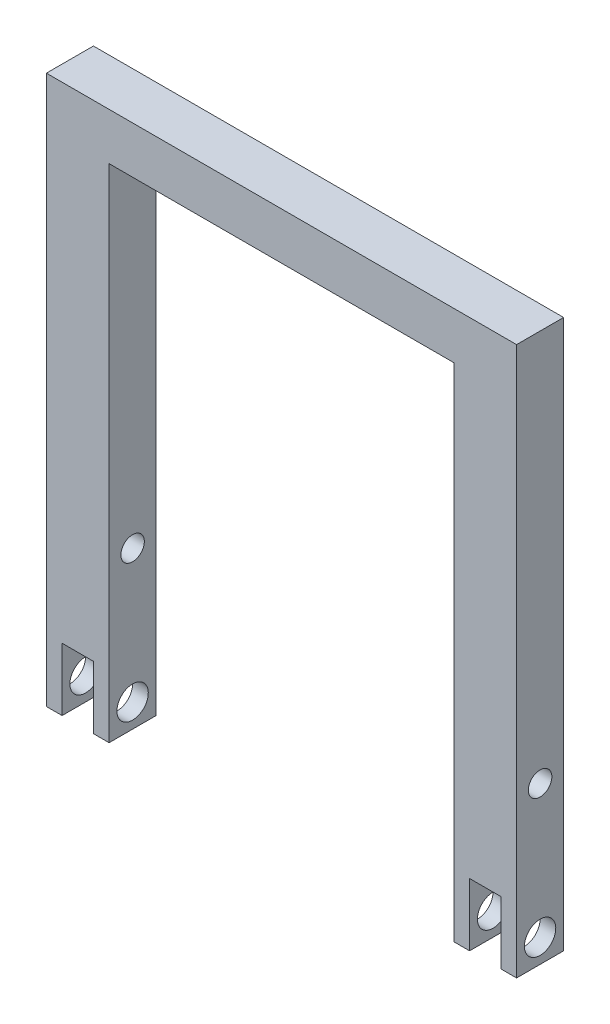
ISO-10303-21;
HEADER;
FILE_DESCRIPTION(('STEP AP214'),'2;1');
FILE_NAME('part.step','',(''),(''),'','','');
FILE_SCHEMA(('AUTOMOTIVE_DESIGN { 1 0 10303 214 1 1 1 1 }'));
ENDSEC;
DATA;
#1=APPLICATION_CONTEXT('core data for automotive mechanical design processes');
#2=APPLICATION_PROTOCOL_DEFINITION('international standard','automotive_design',2000,#1);
#3=PRODUCT_CONTEXT('',#1,'mechanical');
#4=PRODUCT('Part','Part','',(#3));
#5=PRODUCT_RELATED_PRODUCT_CATEGORY('part','',(#4));
#6=PRODUCT_DEFINITION_FORMATION('','',#4);
#7=PRODUCT_DEFINITION_CONTEXT('part definition',#1,'design');
#8=PRODUCT_DEFINITION('design','',#6,#7);
#9=PRODUCT_DEFINITION_SHAPE('','',#8);
#10=(LENGTH_UNIT() NAMED_UNIT(*) SI_UNIT(.MILLI.,.METRE.));
#11=(NAMED_UNIT(*) PLANE_ANGLE_UNIT() SI_UNIT($,.RADIAN.));
#12=(NAMED_UNIT(*) SI_UNIT($,.STERADIAN.) SOLID_ANGLE_UNIT());
#13=UNCERTAINTY_MEASURE_WITH_UNIT(LENGTH_MEASURE(1.E-05),#10,'distance_accuracy_value','');
#14=(GEOMETRIC_REPRESENTATION_CONTEXT(3) GLOBAL_UNCERTAINTY_ASSIGNED_CONTEXT((#13)) GLOBAL_UNIT_ASSIGNED_CONTEXT((#10,
#11,#12)) REPRESENTATION_CONTEXT('',''));
#15=CARTESIAN_POINT('',(0.,0.,0.));
#16=DIRECTION('',(0.,0.,1.));
#17=DIRECTION('',(1.,0.,0.));
#18=AXIS2_PLACEMENT_3D('',#15,#16,#17);
#19=CARTESIAN_POINT('',(-150.,-170.717131474104,30.));
#20=DIRECTION('',(0.,1.,0.));
#21=DIRECTION('',(0.,0.,1.));
#22=AXIS2_PLACEMENT_3D('',#19,#20,#21);
#23=PLANE('',#22);
#24=DIRECTION('',(1.,0.,0.));
#25=VECTOR('',#24,1.);
#26=CARTESIAN_POINT('',(-150.,-170.717131474104,0.));
#27=LINE('',#26,#25);
#28=CARTESIAN_POINT('',(110.,-170.717131474104,0.));
#29=VERTEX_POINT('',#28);
#30=CARTESIAN_POINT('',(120.,-170.717131474104,0.));
#31=VERTEX_POINT('',#30);
#32=EDGE_CURVE('E271',#29,#31,#27,.T.);
#33=ORIENTED_EDGE('',*,*,#32,.T.);
#34=DIRECTION('',(0.,0.,-1.));
#35=VECTOR('',#34,1.);
#36=CARTESIAN_POINT('',(120.,-170.717131474104,30.));
#37=LINE('',#36,#35);
#38=CARTESIAN_POINT('',(120.,-170.717131474104,30.));
#39=VERTEX_POINT('',#38);
#40=EDGE_CURVE('E299',#39,#31,#37,.T.);
#41=ORIENTED_EDGE('',*,*,#40,.F.);
#42=DIRECTION('',(1.,0.,0.));
#43=VECTOR('',#42,1.);
#44=CARTESIAN_POINT('',(-150.,-170.717131474104,30.));
#45=LINE('',#44,#43);
#46=CARTESIAN_POINT('',(110.,-170.717131474104,30.));
#47=VERTEX_POINT('',#46);
#48=EDGE_CURVE('E259',#47,#39,#45,.T.);
#49=ORIENTED_EDGE('',*,*,#48,.F.);
#50=DIRECTION('',(0.,0.,1.));
#51=VECTOR('',#50,1.);
#52=CARTESIAN_POINT('',(110.,-170.717131474104,0.));
#53=LINE('',#52,#51);
#54=EDGE_CURVE('E245',#29,#47,#53,.T.);
#55=ORIENTED_EDGE('',*,*,#54,.F.);
#56=EDGE_LOOP('',(#33,#41,#49,#55));
#57=FACE_BOUND('',#56,.T.);
#58=ADVANCED_FACE('F33',(#57),#23,.F.);
#59=CARTESIAN_POINT('',(150.,-155.717131474104,15.));
#60=DIRECTION('',(-1.,0.,0.));
#61=DIRECTION('',(0.,-1.,0.));
#62=AXIS2_PLACEMENT_3D('',#59,#60,#61);
#63=CYLINDRICAL_SURFACE('',#62,10.);
#64=CARTESIAN_POINT('',(120.,-155.717131474104,15.));
#65=DIRECTION('',(-1.,0.,0.));
#66=DIRECTION('',(0.,0.,1.));
#67=AXIS2_PLACEMENT_3D('',#64,#65,#66);
#68=CIRCLE('',#67,10.);
#69=CARTESIAN_POINT('',(120.,-155.717131474104,25.0000000000001));
#70=VERTEX_POINT('',#69);
#71=EDGE_CURVE('E37',#70,#70,#68,.F.);
#72=ORIENTED_EDGE('',*,*,#71,.T.);
#73=EDGE_LOOP('',(#72));
#74=FACE_BOUND('',#73,.T.);
#75=CARTESIAN_POINT('',(110.,-155.717131474104,15.));
#76=DIRECTION('',(1.,0.,0.));
#77=DIRECTION('',(0.,1.,0.));
#78=AXIS2_PLACEMENT_3D('',#75,#76,#77);
#79=CIRCLE('',#78,10.);
#80=CARTESIAN_POINT('',(110.,-145.717131474104,15.));
#81=VERTEX_POINT('',#80);
#82=EDGE_CURVE('E203',#81,#81,#79,.T.);
#83=ORIENTED_EDGE('',*,*,#82,.F.);
#84=EDGE_LOOP('',(#83));
#85=FACE_BOUND('',#84,.T.);
#86=ADVANCED_FACE('F362',(#74,#85),#63,.F.);
#87=CARTESIAN_POINT('',(-150.,-170.717131474104,0.));
#88=VERTEX_POINT('',#87);
#89=CARTESIAN_POINT('',(-140.,-170.717131474104,0.));
#90=VERTEX_POINT('',#89);
#91=EDGE_CURVE('E266',#88,#90,#27,.T.);
#92=ORIENTED_EDGE('',*,*,#91,.T.);
#93=DIRECTION('',(0.,0.,-1.));
#94=VECTOR('',#93,1.);
#95=CARTESIAN_POINT('',(-140.,-170.717131474104,30.));
#96=LINE('',#95,#94);
#97=CARTESIAN_POINT('',(-140.,-170.717131474104,30.));
#98=VERTEX_POINT('',#97);
#99=EDGE_CURVE('E187',#98,#90,#96,.T.);
#100=ORIENTED_EDGE('',*,*,#99,.F.);
#101=CARTESIAN_POINT('',(-150.,-170.717131474104,30.));
#102=VERTEX_POINT('',#101);
#103=EDGE_CURVE('E254',#102,#98,#45,.T.);
#104=ORIENTED_EDGE('',*,*,#103,.F.);
#105=DIRECTION('',(0.,0.,-1.));
#106=VECTOR('',#105,1.);
#107=CARTESIAN_POINT('',(-150.,-170.717131474104,30.));
#108=LINE('',#107,#106);
#109=EDGE_CURVE('E11',#102,#88,#108,.T.);
#110=ORIENTED_EDGE('',*,*,#109,.T.);
#111=EDGE_LOOP('',(#92,#100,#104,#110));
#112=FACE_BOUND('',#111,.T.);
#113=ADVANCED_FACE('F329',(#112),#23,.F.);
#114=CARTESIAN_POINT('',(-140.,-155.717131474104,15.));
#115=DIRECTION('',(-1.,0.,0.));
#116=DIRECTION('',(0.,0.,1.));
#117=AXIS2_PLACEMENT_3D('',#114,#115,#116);
#118=CIRCLE('',#117,10.);
#119=CARTESIAN_POINT('',(-140.,-155.717131474104,25.0000000000001));
#120=VERTEX_POINT('',#119);
#121=EDGE_CURVE('E207',#120,#120,#118,.F.);
#122=ORIENTED_EDGE('',*,*,#121,.T.);
#123=EDGE_LOOP('',(#122));
#124=FACE_BOUND('',#123,.T.);
#125=CARTESIAN_POINT('',(-150.,-155.717131474104,15.));
#126=DIRECTION('',(-1.,0.,0.));
#127=DIRECTION('',(0.,-1.,0.));
#128=AXIS2_PLACEMENT_3D('',#125,#126,#127);
#129=CIRCLE('',#128,10.);
#130=CARTESIAN_POINT('',(-150.,-165.717131474104,15.));
#131=VERTEX_POINT('',#130);
#132=EDGE_CURVE('E204',#131,#131,#129,.T.);
#133=ORIENTED_EDGE('',*,*,#132,.T.);
#134=EDGE_LOOP('',(#133));
#135=FACE_BOUND('',#134,.T.);
#136=ADVANCED_FACE('F366',(#124,#135),#63,.F.);
#137=CARTESIAN_POINT('',(-120.,-170.717131474104,30.));
#138=VERTEX_POINT('',#137);
#139=CARTESIAN_POINT('',(-110.,-170.717131474104,30.));
#140=VERTEX_POINT('',#139);
#141=EDGE_CURVE('E258',#138,#140,#45,.T.);
#142=ORIENTED_EDGE('',*,*,#141,.F.);
#143=DIRECTION('',(0.,0.,1.));
#144=VECTOR('',#143,1.);
#145=CARTESIAN_POINT('',(-120.,-170.717131474104,30.));
#146=LINE('',#145,#144);
#147=CARTESIAN_POINT('',(-120.,-170.717131474104,0.));
#148=VERTEX_POINT('',#147);
#149=EDGE_CURVE('E179',#148,#138,#146,.T.);
#150=ORIENTED_EDGE('',*,*,#149,.F.);
#151=CARTESIAN_POINT('',(-110.,-170.717131474104,0.));
#152=VERTEX_POINT('',#151);
#153=EDGE_CURVE('E270',#148,#152,#27,.T.);
#154=ORIENTED_EDGE('',*,*,#153,.T.);
#155=DIRECTION('',(0.,0.,1.));
#156=VECTOR('',#155,1.);
#157=CARTESIAN_POINT('',(-110.,-170.717131474104,0.));
#158=LINE('',#157,#156);
#159=EDGE_CURVE('E232',#152,#140,#158,.T.);
#160=ORIENTED_EDGE('',*,*,#159,.T.);
#161=EDGE_LOOP('',(#142,#150,#154,#160));
#162=FACE_BOUND('',#161,.T.);
#163=ADVANCED_FACE('F344',(#162),#23,.F.);
#164=CARTESIAN_POINT('',(-150.,179.282868525896,30.));
#165=DIRECTION('',(1.,0.,0.));
#166=DIRECTION('',(0.,1.,0.));
#167=AXIS2_PLACEMENT_3D('',#164,#165,#166);
#168=PLANE('',#167);
#169=ORIENTED_EDGE('',*,*,#132,.F.);
#170=EDGE_LOOP('',(#169));
#171=FACE_BOUND('',#170,.T.);
#172=CARTESIAN_POINT('',(-150.,-70.7171314741036,15.));
#173=DIRECTION('',(-1.,0.,0.));
#174=DIRECTION('',(0.,-1.,0.));
#175=AXIS2_PLACEMENT_3D('',#172,#173,#174);
#176=CIRCLE('',#175,7.5);
#177=CARTESIAN_POINT('',(-150.,-78.2171314741036,15.));
#178=VERTEX_POINT('',#177);
#179=EDGE_CURVE('E211',#178,#178,#176,.T.);
#180=ORIENTED_EDGE('',*,*,#179,.F.);
#181=EDGE_LOOP('',(#180));
#182=FACE_BOUND('',#181,.T.);
#183=DIRECTION('',(0.,-1.,0.));
#184=VECTOR('',#183,1.);
#185=CARTESIAN_POINT('',(-150.,179.282868525896,0.));
#186=LINE('',#185,#184);
#187=CARTESIAN_POINT('',(-150.,179.282868525896,0.));
#188=VERTEX_POINT('',#187);
#189=EDGE_CURVE('E242',#188,#88,#186,.T.);
#190=ORIENTED_EDGE('',*,*,#189,.T.);
#191=ORIENTED_EDGE('',*,*,#109,.F.);
#192=DIRECTION('',(0.,-1.,0.));
#193=VECTOR('',#192,1.);
#194=CARTESIAN_POINT('',(-150.,179.282868525896,30.));
#195=LINE('',#194,#193);
#196=CARTESIAN_POINT('',(-150.,179.282868525896,30.));
#197=VERTEX_POINT('',#196);
#198=EDGE_CURVE('E249',#197,#102,#195,.T.);
#199=ORIENTED_EDGE('',*,*,#198,.F.);
#200=DIRECTION('',(0.,0.,-1.));
#201=VECTOR('',#200,1.);
#202=CARTESIAN_POINT('',(-150.,179.282868525896,30.));
#203=LINE('',#202,#201);
#204=EDGE_CURVE('E263',#197,#188,#203,.T.);
#205=ORIENTED_EDGE('',*,*,#204,.T.);
#206=EDGE_LOOP('',(#190,#191,#199,#205));
#207=FACE_BOUND('',#206,.T.);
#208=ADVANCED_FACE('F35',(#171,#182,#207),#168,.F.);
#209=CARTESIAN_POINT('',(140.,-170.717131474104,30.));
#210=VERTEX_POINT('',#209);
#211=CARTESIAN_POINT('',(150.,-170.717131474104,30.));
#212=VERTEX_POINT('',#211);
#213=EDGE_CURVE('E252',#210,#212,#45,.T.);
#214=ORIENTED_EDGE('',*,*,#213,.F.);
#215=DIRECTION('',(0.,0.,1.));
#216=VECTOR('',#215,1.);
#217=CARTESIAN_POINT('',(140.,-170.717131474104,30.));
#218=LINE('',#217,#216);
#219=CARTESIAN_POINT('',(140.,-170.717131474104,0.));
#220=VERTEX_POINT('',#219);
#221=EDGE_CURVE('E297',#220,#210,#218,.T.);
#222=ORIENTED_EDGE('',*,*,#221,.F.);
#223=CARTESIAN_POINT('',(150.,-170.717131474104,0.));
#224=VERTEX_POINT('',#223);
#225=EDGE_CURVE('E169',#220,#224,#27,.T.);
#226=ORIENTED_EDGE('',*,*,#225,.T.);
#227=DIRECTION('',(0.,0.,-1.));
#228=VECTOR('',#227,1.);
#229=CARTESIAN_POINT('',(150.,-170.717131474104,30.));
#230=LINE('',#229,#228);
#231=EDGE_CURVE('E42',#212,#224,#230,.T.);
#232=ORIENTED_EDGE('',*,*,#231,.F.);
#233=EDGE_LOOP('',(#214,#222,#226,#232));
#234=FACE_BOUND('',#233,.T.);
#235=ADVANCED_FACE('F315',(#234),#23,.F.);
#236=CARTESIAN_POINT('',(150.,179.282868525896,30.));
#237=DIRECTION('',(-1.,0.,0.));
#238=DIRECTION('',(0.,-1.,0.));
#239=AXIS2_PLACEMENT_3D('',#236,#237,#238);
#240=PLANE('',#239);
#241=CARTESIAN_POINT('',(150.,-155.717131474104,15.));
#242=DIRECTION('',(-1.,0.,0.));
#243=DIRECTION('',(0.,-1.,0.));
#244=AXIS2_PLACEMENT_3D('',#241,#242,#243);
#245=CIRCLE('',#244,10.);
#246=CARTESIAN_POINT('',(150.,-165.717131474104,15.));
#247=VERTEX_POINT('',#246);
#248=EDGE_CURVE('E200',#247,#247,#245,.T.);
#249=ORIENTED_EDGE('',*,*,#248,.T.);
#250=EDGE_LOOP('',(#249));
#251=FACE_BOUND('',#250,.T.);
#252=CARTESIAN_POINT('',(150.,-70.7171314741036,15.));
#253=DIRECTION('',(-1.,0.,0.));
#254=DIRECTION('',(0.,-1.,0.));
#255=AXIS2_PLACEMENT_3D('',#252,#253,#254);
#256=CIRCLE('',#255,7.5);
#257=CARTESIAN_POINT('',(150.,-78.2171314741036,15.));
#258=VERTEX_POINT('',#257);
#259=EDGE_CURVE('E212',#258,#258,#256,.T.);
#260=ORIENTED_EDGE('',*,*,#259,.T.);
#261=EDGE_LOOP('',(#260));
#262=FACE_BOUND('',#261,.T.);
#263=DIRECTION('',(0.,1.,0.));
#264=VECTOR('',#263,1.);
#265=CARTESIAN_POINT('',(150.,179.282868525896,0.));
#266=LINE('',#265,#264);
#267=CARTESIAN_POINT('',(150.,179.282868525896,0.));
#268=VERTEX_POINT('',#267);
#269=EDGE_CURVE('E269',#224,#268,#266,.T.);
#270=ORIENTED_EDGE('',*,*,#269,.T.);
#271=DIRECTION('',(0.,0.,-1.));
#272=VECTOR('',#271,1.);
#273=CARTESIAN_POINT('',(150.,179.282868525896,30.));
#274=LINE('',#273,#272);
#275=CARTESIAN_POINT('',(150.,179.282868525896,30.));
#276=VERTEX_POINT('',#275);
#277=EDGE_CURVE('E276',#276,#268,#274,.T.);
#278=ORIENTED_EDGE('',*,*,#277,.F.);
#279=DIRECTION('',(0.,1.,0.));
#280=VECTOR('',#279,1.);
#281=CARTESIAN_POINT('',(150.,179.282868525896,30.));
#282=LINE('',#281,#280);
#283=EDGE_CURVE('E257',#212,#276,#282,.T.);
#284=ORIENTED_EDGE('',*,*,#283,.F.);
#285=ORIENTED_EDGE('',*,*,#231,.T.);
#286=EDGE_LOOP('',(#270,#278,#284,#285));
#287=FACE_BOUND('',#286,.T.);
#288=ADVANCED_FACE('F317',(#251,#262,#287),#240,.F.);
#289=CARTESIAN_POINT('',(-150.,179.282868525896,30.));
#290=DIRECTION('',(0.,-1.,0.));
#291=DIRECTION('',(0.,0.,-1.));
#292=AXIS2_PLACEMENT_3D('',#289,#290,#291);
#293=PLANE('',#292);
#294=DIRECTION('',(-1.,0.,0.));
#295=VECTOR('',#294,1.);
#296=CARTESIAN_POINT('',(-150.,179.282868525896,0.));
#297=LINE('',#296,#295);
#298=EDGE_CURVE('E253',#268,#188,#297,.T.);
#299=ORIENTED_EDGE('',*,*,#298,.T.);
#300=ORIENTED_EDGE('',*,*,#204,.F.);
#301=DIRECTION('',(-1.,0.,0.));
#302=VECTOR('',#301,1.);
#303=CARTESIAN_POINT('',(-150.,179.282868525896,30.));
#304=LINE('',#303,#302);
#305=EDGE_CURVE('E261',#276,#197,#304,.T.);
#306=ORIENTED_EDGE('',*,*,#305,.F.);
#307=ORIENTED_EDGE('',*,*,#277,.T.);
#308=EDGE_LOOP('',(#299,#300,#306,#307));
#309=FACE_BOUND('',#308,.T.);
#310=ADVANCED_FACE('F322',(#309),#293,.F.);
#311=CARTESIAN_POINT('',(0.,0.,30.));
#312=DIRECTION('',(0.,0.,1.));
#313=DIRECTION('',(1.,0.,0.));
#314=AXIS2_PLACEMENT_3D('',#311,#312,#313);
#315=PLANE('',#314);
#316=DIRECTION('',(0.,-1.,0.));
#317=VECTOR('',#316,1.);
#318=CARTESIAN_POINT('',(120.,-130.717131474104,30.));
#319=LINE('',#318,#317);
#320=CARTESIAN_POINT('',(120.,-130.717131474104,30.));
#321=VERTEX_POINT('',#320);
#322=EDGE_CURVE('E172',#321,#39,#319,.T.);
#323=ORIENTED_EDGE('',*,*,#322,.F.);
#324=DIRECTION('',(-1.,0.,0.));
#325=VECTOR('',#324,1.);
#326=CARTESIAN_POINT('',(120.,-130.717131474104,30.));
#327=LINE('',#326,#325);
#328=CARTESIAN_POINT('',(140.,-130.717131474104,30.));
#329=VERTEX_POINT('',#328);
#330=EDGE_CURVE('E158',#329,#321,#327,.T.);
#331=ORIENTED_EDGE('',*,*,#330,.F.);
#332=DIRECTION('',(0.,-1.,0.));
#333=VECTOR('',#332,1.);
#334=CARTESIAN_POINT('',(140.,-130.717131474104,30.));
#335=LINE('',#334,#333);
#336=EDGE_CURVE('E156',#329,#210,#335,.T.);
#337=ORIENTED_EDGE('',*,*,#336,.T.);
#338=ORIENTED_EDGE('',*,*,#213,.T.);
#339=ORIENTED_EDGE('',*,*,#283,.T.);
#340=ORIENTED_EDGE('',*,*,#305,.T.);
#341=ORIENTED_EDGE('',*,*,#198,.T.);
#342=ORIENTED_EDGE('',*,*,#103,.T.);
#343=DIRECTION('',(0.,-1.,0.));
#344=VECTOR('',#343,1.);
#345=CARTESIAN_POINT('',(-140.,-130.717131474104,30.));
#346=LINE('',#345,#344);
#347=CARTESIAN_POINT('',(-140.,-130.717131474104,30.));
#348=VERTEX_POINT('',#347);
#349=EDGE_CURVE('E190',#348,#98,#346,.T.);
#350=ORIENTED_EDGE('',*,*,#349,.F.);
#351=DIRECTION('',(-1.,0.,0.));
#352=VECTOR('',#351,1.);
#353=CARTESIAN_POINT('',(-140.,-130.717131474104,30.));
#354=LINE('',#353,#352);
#355=CARTESIAN_POINT('',(-120.,-130.717131474104,30.));
#356=VERTEX_POINT('',#355);
#357=EDGE_CURVE('E184',#356,#348,#354,.T.);
#358=ORIENTED_EDGE('',*,*,#357,.F.);
#359=DIRECTION('',(0.,-1.,0.));
#360=VECTOR('',#359,1.);
#361=CARTESIAN_POINT('',(-120.,-130.717131474104,30.));
#362=LINE('',#361,#360);
#363=EDGE_CURVE('E193',#356,#138,#362,.T.);
#364=ORIENTED_EDGE('',*,*,#363,.T.);
#365=ORIENTED_EDGE('',*,*,#141,.T.);
#366=DIRECTION('',(0.,-1.,0.));
#367=VECTOR('',#366,1.);
#368=CARTESIAN_POINT('',(-110.,149.282868525896,30.));
#369=LINE('',#368,#367);
#370=CARTESIAN_POINT('',(-110.,149.282868525896,30.));
#371=VERTEX_POINT('',#370);
#372=EDGE_CURVE('E221',#371,#140,#369,.T.);
#373=ORIENTED_EDGE('',*,*,#372,.F.);
#374=DIRECTION('',(-1.,0.,0.));
#375=VECTOR('',#374,1.);
#376=CARTESIAN_POINT('',(-110.,149.282868525896,30.));
#377=LINE('',#376,#375);
#378=CARTESIAN_POINT('',(110.,149.282868525896,30.));
#379=VERTEX_POINT('',#378);
#380=EDGE_CURVE('E226',#379,#371,#377,.T.);
#381=ORIENTED_EDGE('',*,*,#380,.F.);
#382=DIRECTION('',(0.,1.,0.));
#383=VECTOR('',#382,1.);
#384=CARTESIAN_POINT('',(110.,149.282868525896,30.));
#385=LINE('',#384,#383);
#386=EDGE_CURVE('E235',#47,#379,#385,.T.);
#387=ORIENTED_EDGE('',*,*,#386,.F.);
#388=ORIENTED_EDGE('',*,*,#48,.T.);
#389=EDGE_LOOP('',(#323,#331,#337,#338,#339,#340,#341,#342,#350,#358,#364,#365,#373,#381,#387,#388));
#390=FACE_BOUND('',#389,.T.);
#391=ADVANCED_FACE('F304',(#390),#315,.T.);
#392=CARTESIAN_POINT('',(0.,0.,0.));
#393=DIRECTION('',(0.,0.,1.));
#394=DIRECTION('',(1.,0.,0.));
#395=AXIS2_PLACEMENT_3D('',#392,#393,#394);
#396=PLANE('',#395);
#397=DIRECTION('',(1.,0.,0.));
#398=VECTOR('',#397,1.);
#399=CARTESIAN_POINT('',(120.,-130.717131474104,0.));
#400=LINE('',#399,#398);
#401=CARTESIAN_POINT('',(120.,-130.717131474104,0.));
#402=VERTEX_POINT('',#401);
#403=CARTESIAN_POINT('',(140.,-130.717131474104,0.));
#404=VERTEX_POINT('',#403);
#405=EDGE_CURVE('E159',#402,#404,#400,.T.);
#406=ORIENTED_EDGE('',*,*,#405,.F.);
#407=DIRECTION('',(0.,-1.,0.));
#408=VECTOR('',#407,1.);
#409=CARTESIAN_POINT('',(120.,-130.717131474104,0.));
#410=LINE('',#409,#408);
#411=EDGE_CURVE('E170',#402,#31,#410,.T.);
#412=ORIENTED_EDGE('',*,*,#411,.T.);
#413=ORIENTED_EDGE('',*,*,#32,.F.);
#414=DIRECTION('',(0.,1.,0.));
#415=VECTOR('',#414,1.);
#416=CARTESIAN_POINT('',(110.,149.282868525896,0.));
#417=LINE('',#416,#415);
#418=CARTESIAN_POINT('',(110.,149.282868525896,0.));
#419=VERTEX_POINT('',#418);
#420=EDGE_CURVE('E225',#29,#419,#417,.T.);
#421=ORIENTED_EDGE('',*,*,#420,.T.);
#422=DIRECTION('',(-1.,0.,0.));
#423=VECTOR('',#422,1.);
#424=CARTESIAN_POINT('',(-110.,149.282868525896,0.));
#425=LINE('',#424,#423);
#426=CARTESIAN_POINT('',(-110.,149.282868525896,0.));
#427=VERTEX_POINT('',#426);
#428=EDGE_CURVE('E229',#419,#427,#425,.T.);
#429=ORIENTED_EDGE('',*,*,#428,.T.);
#430=DIRECTION('',(0.,-1.,0.));
#431=VECTOR('',#430,1.);
#432=CARTESIAN_POINT('',(-110.,149.282868525896,0.));
#433=LINE('',#432,#431);
#434=EDGE_CURVE('E222',#427,#152,#433,.T.);
#435=ORIENTED_EDGE('',*,*,#434,.T.);
#436=ORIENTED_EDGE('',*,*,#153,.F.);
#437=DIRECTION('',(0.,-1.,0.));
#438=VECTOR('',#437,1.);
#439=CARTESIAN_POINT('',(-120.,-130.717131474104,0.));
#440=LINE('',#439,#438);
#441=CARTESIAN_POINT('',(-120.,-130.717131474104,0.));
#442=VERTEX_POINT('',#441);
#443=EDGE_CURVE('E196',#442,#148,#440,.T.);
#444=ORIENTED_EDGE('',*,*,#443,.F.);
#445=DIRECTION('',(1.,0.,0.));
#446=VECTOR('',#445,1.);
#447=CARTESIAN_POINT('',(-140.,-130.717131474104,0.));
#448=LINE('',#447,#446);
#449=CARTESIAN_POINT('',(-140.,-130.717131474104,0.));
#450=VERTEX_POINT('',#449);
#451=EDGE_CURVE('E178',#450,#442,#448,.T.);
#452=ORIENTED_EDGE('',*,*,#451,.F.);
#453=DIRECTION('',(0.,-1.,0.));
#454=VECTOR('',#453,1.);
#455=CARTESIAN_POINT('',(-140.,-130.717131474104,0.));
#456=LINE('',#455,#454);
#457=EDGE_CURVE('E186',#450,#90,#456,.T.);
#458=ORIENTED_EDGE('',*,*,#457,.T.);
#459=ORIENTED_EDGE('',*,*,#91,.F.);
#460=ORIENTED_EDGE('',*,*,#189,.F.);
#461=ORIENTED_EDGE('',*,*,#298,.F.);
#462=ORIENTED_EDGE('',*,*,#269,.F.);
#463=ORIENTED_EDGE('',*,*,#225,.F.);
#464=DIRECTION('',(0.,-1.,0.));
#465=VECTOR('',#464,1.);
#466=CARTESIAN_POINT('',(140.,-130.717131474104,0.));
#467=LINE('',#466,#465);
#468=EDGE_CURVE('E153',#404,#220,#467,.T.);
#469=ORIENTED_EDGE('',*,*,#468,.F.);
#470=EDGE_LOOP('',(#406,#412,#413,#421,#429,#435,#436,#444,#452,#458,#459,#460,#461,#462,#463,#469));
#471=FACE_BOUND('',#470,.T.);
#472=ADVANCED_FACE('F167',(#471),#396,.F.);
#473=CARTESIAN_POINT('',(-110.,149.282868525896,0.));
#474=DIRECTION('',(-1.,0.,0.));
#475=DIRECTION('',(0.,-1.,0.));
#476=AXIS2_PLACEMENT_3D('',#473,#474,#475);
#477=PLANE('',#476);
#478=CARTESIAN_POINT('',(-110.,-155.717131474104,15.));
#479=DIRECTION('',(-1.,0.,0.));
#480=DIRECTION('',(0.,-1.,0.));
#481=AXIS2_PLACEMENT_3D('',#478,#479,#480);
#482=CIRCLE('',#481,10.);
#483=CARTESIAN_POINT('',(-110.,-165.717131474104,15.));
#484=VERTEX_POINT('',#483);
#485=EDGE_CURVE('E208',#484,#484,#482,.T.);
#486=ORIENTED_EDGE('',*,*,#485,.T.);
#487=EDGE_LOOP('',(#486));
#488=FACE_BOUND('',#487,.T.);
#489=CARTESIAN_POINT('',(-110.,-70.7171314741036,15.));
#490=DIRECTION('',(-1.,0.,0.));
#491=DIRECTION('',(0.,-1.,0.));
#492=AXIS2_PLACEMENT_3D('',#489,#490,#491);
#493=CIRCLE('',#492,7.5);
#494=CARTESIAN_POINT('',(-110.,-78.2171314741036,15.));
#495=VERTEX_POINT('',#494);
#496=EDGE_CURVE('E218',#495,#495,#493,.T.);
#497=ORIENTED_EDGE('',*,*,#496,.T.);
#498=EDGE_LOOP('',(#497));
#499=FACE_BOUND('',#498,.T.);
#500=ORIENTED_EDGE('',*,*,#372,.T.);
#501=ORIENTED_EDGE('',*,*,#159,.F.);
#502=ORIENTED_EDGE('',*,*,#434,.F.);
#503=DIRECTION('',(0.,0.,1.));
#504=VECTOR('',#503,1.);
#505=CARTESIAN_POINT('',(-110.,149.282868525896,0.));
#506=LINE('',#505,#504);
#507=EDGE_CURVE('E240',#427,#371,#506,.T.);
#508=ORIENTED_EDGE('',*,*,#507,.T.);
#509=EDGE_LOOP('',(#500,#501,#502,#508));
#510=FACE_BOUND('',#509,.T.);
#511=ADVANCED_FACE('F348',(#488,#499,#510),#477,.F.);
#512=CARTESIAN_POINT('',(-110.,149.282868525896,0.));
#513=DIRECTION('',(0.,1.,0.));
#514=DIRECTION('',(0.,0.,1.));
#515=AXIS2_PLACEMENT_3D('',#512,#513,#514);
#516=PLANE('',#515);
#517=ORIENTED_EDGE('',*,*,#380,.T.);
#518=ORIENTED_EDGE('',*,*,#507,.F.);
#519=ORIENTED_EDGE('',*,*,#428,.F.);
#520=DIRECTION('',(0.,0.,1.));
#521=VECTOR('',#520,1.);
#522=CARTESIAN_POINT('',(110.,149.282868525896,0.));
#523=LINE('',#522,#521);
#524=EDGE_CURVE('E243',#419,#379,#523,.T.);
#525=ORIENTED_EDGE('',*,*,#524,.T.);
#526=EDGE_LOOP('',(#517,#518,#519,#525));
#527=FACE_BOUND('',#526,.T.);
#528=ADVANCED_FACE('F352',(#527),#516,.F.);
#529=CARTESIAN_POINT('',(110.,149.282868525896,0.));
#530=DIRECTION('',(1.,0.,0.));
#531=DIRECTION('',(0.,1.,0.));
#532=AXIS2_PLACEMENT_3D('',#529,#530,#531);
#533=PLANE('',#532);
#534=ORIENTED_EDGE('',*,*,#82,.T.);
#535=EDGE_LOOP('',(#534));
#536=FACE_BOUND('',#535,.T.);
#537=CARTESIAN_POINT('',(110.,-70.7171314741036,15.));
#538=DIRECTION('',(1.,0.,0.));
#539=DIRECTION('',(0.,1.,0.));
#540=AXIS2_PLACEMENT_3D('',#537,#538,#539);
#541=CIRCLE('',#540,7.5);
#542=CARTESIAN_POINT('',(110.,-63.2171314741035,15.));
#543=VERTEX_POINT('',#542);
#544=EDGE_CURVE('E215',#543,#543,#541,.T.);
#545=ORIENTED_EDGE('',*,*,#544,.T.);
#546=EDGE_LOOP('',(#545));
#547=FACE_BOUND('',#546,.T.);
#548=ORIENTED_EDGE('',*,*,#386,.T.);
#549=ORIENTED_EDGE('',*,*,#524,.F.);
#550=ORIENTED_EDGE('',*,*,#420,.F.);
#551=ORIENTED_EDGE('',*,*,#54,.T.);
#552=EDGE_LOOP('',(#548,#549,#550,#551));
#553=FACE_BOUND('',#552,.T.);
#554=ADVANCED_FACE('F354',(#536,#547,#553),#533,.F.);
#555=CARTESIAN_POINT('',(150.,-70.7171314741036,15.));
#556=DIRECTION('',(-1.,0.,0.));
#557=DIRECTION('',(0.,-1.,0.));
#558=AXIS2_PLACEMENT_3D('',#555,#556,#557);
#559=CYLINDRICAL_SURFACE('',#558,7.5);
#560=ORIENTED_EDGE('',*,*,#259,.F.);
#561=EDGE_LOOP('',(#560));
#562=FACE_BOUND('',#561,.T.);
#563=ORIENTED_EDGE('',*,*,#544,.F.);
#564=EDGE_LOOP('',(#563));
#565=FACE_BOUND('',#564,.T.);
#566=ADVANCED_FACE('F372',(#562,#565),#559,.F.);
#567=ORIENTED_EDGE('',*,*,#179,.T.);
#568=EDGE_LOOP('',(#567));
#569=FACE_BOUND('',#568,.T.);
#570=ORIENTED_EDGE('',*,*,#496,.F.);
#571=EDGE_LOOP('',(#570));
#572=FACE_BOUND('',#571,.T.);
#573=ADVANCED_FACE('F377',(#569,#572),#559,.F.);
#574=CARTESIAN_POINT('',(140.,-155.717131474104,15.));
#575=DIRECTION('',(1.,0.,0.));
#576=DIRECTION('',(0.,0.,-1.));
#577=AXIS2_PLACEMENT_3D('',#574,#575,#576);
#578=CIRCLE('',#577,10.);
#579=CARTESIAN_POINT('',(140.,-155.717131474104,5.00000000000003));
#580=VERTEX_POINT('',#579);
#581=EDGE_CURVE('E288',#580,#580,#578,.F.);
#582=ORIENTED_EDGE('',*,*,#581,.T.);
#583=EDGE_LOOP('',(#582));
#584=FACE_BOUND('',#583,.T.);
#585=ORIENTED_EDGE('',*,*,#248,.F.);
#586=EDGE_LOOP('',(#585));
#587=FACE_BOUND('',#586,.T.);
#588=ADVANCED_FACE('F383',(#584,#587),#63,.F.);
#589=CARTESIAN_POINT('',(-120.,-155.717131474104,15.));
#590=DIRECTION('',(1.,0.,0.));
#591=DIRECTION('',(0.,0.,-1.));
#592=AXIS2_PLACEMENT_3D('',#589,#590,#591);
#593=CIRCLE('',#592,10.);
#594=CARTESIAN_POINT('',(-120.,-155.717131474104,5.00000000000003));
#595=VERTEX_POINT('',#594);
#596=EDGE_CURVE('E192',#595,#595,#593,.F.);
#597=ORIENTED_EDGE('',*,*,#596,.T.);
#598=EDGE_LOOP('',(#597));
#599=FACE_BOUND('',#598,.T.);
#600=ORIENTED_EDGE('',*,*,#485,.F.);
#601=EDGE_LOOP('',(#600));
#602=FACE_BOUND('',#601,.T.);
#603=ADVANCED_FACE('F367',(#599,#602),#63,.F.);
#604=CARTESIAN_POINT('',(-140.,-130.717131474104,30.));
#605=DIRECTION('',(-1.,0.,0.));
#606=DIRECTION('',(0.,0.,1.));
#607=AXIS2_PLACEMENT_3D('',#604,#605,#606);
#608=PLANE('',#607);
#609=ORIENTED_EDGE('',*,*,#99,.T.);
#610=ORIENTED_EDGE('',*,*,#457,.F.);
#611=DIRECTION('',(0.,0.,-1.));
#612=VECTOR('',#611,1.);
#613=CARTESIAN_POINT('',(-140.,-130.717131474104,30.));
#614=LINE('',#613,#612);
#615=EDGE_CURVE('E58',#348,#450,#614,.T.);
#616=ORIENTED_EDGE('',*,*,#615,.F.);
#617=ORIENTED_EDGE('',*,*,#349,.T.);
#618=EDGE_LOOP('',(#609,#610,#616,#617));
#619=FACE_BOUND('',#618,.T.);
#620=ORIENTED_EDGE('',*,*,#121,.F.);
#621=EDGE_LOOP('',(#620));
#622=FACE_BOUND('',#621,.T.);
#623=ADVANCED_FACE('F332',(#619,#622),#608,.F.);
#624=CARTESIAN_POINT('',(-120.,-130.717131474104,30.));
#625=DIRECTION('',(1.,0.,0.));
#626=DIRECTION('',(0.,0.,-1.));
#627=AXIS2_PLACEMENT_3D('',#624,#625,#626);
#628=PLANE('',#627);
#629=ORIENTED_EDGE('',*,*,#149,.T.);
#630=ORIENTED_EDGE('',*,*,#363,.F.);
#631=DIRECTION('',(0.,0.,1.));
#632=VECTOR('',#631,1.);
#633=CARTESIAN_POINT('',(-120.,-130.717131474104,30.));
#634=LINE('',#633,#632);
#635=EDGE_CURVE('E181',#442,#356,#634,.T.);
#636=ORIENTED_EDGE('',*,*,#635,.F.);
#637=ORIENTED_EDGE('',*,*,#443,.T.);
#638=EDGE_LOOP('',(#629,#630,#636,#637));
#639=FACE_BOUND('',#638,.T.);
#640=ORIENTED_EDGE('',*,*,#596,.F.);
#641=EDGE_LOOP('',(#640));
#642=FACE_BOUND('',#641,.T.);
#643=ADVANCED_FACE('F419',(#639,#642),#628,.F.);
#644=CARTESIAN_POINT('',(0.,-130.717131474104,0.));
#645=DIRECTION('',(0.,-1.,0.));
#646=DIRECTION('',(0.,0.,-1.));
#647=AXIS2_PLACEMENT_3D('',#644,#645,#646);
#648=PLANE('',#647);
#649=ORIENTED_EDGE('',*,*,#615,.T.);
#650=ORIENTED_EDGE('',*,*,#451,.T.);
#651=ORIENTED_EDGE('',*,*,#635,.T.);
#652=ORIENTED_EDGE('',*,*,#357,.T.);
#653=EDGE_LOOP('',(#649,#650,#651,#652));
#654=FACE_BOUND('',#653,.T.);
#655=ADVANCED_FACE('F337',(#654),#648,.T.);
#656=CARTESIAN_POINT('',(120.,-130.717131474104,30.));
#657=DIRECTION('',(-1.,0.,0.));
#658=DIRECTION('',(0.,0.,1.));
#659=AXIS2_PLACEMENT_3D('',#656,#657,#658);
#660=PLANE('',#659);
#661=ORIENTED_EDGE('',*,*,#40,.T.);
#662=ORIENTED_EDGE('',*,*,#411,.F.);
#663=DIRECTION('',(0.,0.,-1.));
#664=VECTOR('',#663,1.);
#665=CARTESIAN_POINT('',(120.,-130.717131474104,30.));
#666=LINE('',#665,#664);
#667=EDGE_CURVE('E50',#321,#402,#666,.T.);
#668=ORIENTED_EDGE('',*,*,#667,.F.);
#669=ORIENTED_EDGE('',*,*,#322,.T.);
#670=EDGE_LOOP('',(#661,#662,#668,#669));
#671=FACE_BOUND('',#670,.T.);
#672=ORIENTED_EDGE('',*,*,#71,.F.);
#673=EDGE_LOOP('',(#672));
#674=FACE_BOUND('',#673,.T.);
#675=ADVANCED_FACE('F356',(#671,#674),#660,.F.);
#676=CARTESIAN_POINT('',(140.,-130.717131474104,30.));
#677=DIRECTION('',(1.,0.,0.));
#678=DIRECTION('',(0.,0.,-1.));
#679=AXIS2_PLACEMENT_3D('',#676,#677,#678);
#680=PLANE('',#679);
#681=ORIENTED_EDGE('',*,*,#221,.T.);
#682=ORIENTED_EDGE('',*,*,#336,.F.);
#683=DIRECTION('',(0.,0.,1.));
#684=VECTOR('',#683,1.);
#685=CARTESIAN_POINT('',(140.,-130.717131474104,30.));
#686=LINE('',#685,#684);
#687=EDGE_CURVE('E149',#404,#329,#686,.T.);
#688=ORIENTED_EDGE('',*,*,#687,.F.);
#689=ORIENTED_EDGE('',*,*,#468,.T.);
#690=EDGE_LOOP('',(#681,#682,#688,#689));
#691=FACE_BOUND('',#690,.T.);
#692=ORIENTED_EDGE('',*,*,#581,.F.);
#693=EDGE_LOOP('',(#692));
#694=FACE_BOUND('',#693,.T.);
#695=ADVANCED_FACE('F150',(#691,#694),#680,.F.);
#696=CARTESIAN_POINT('',(0.,-130.717131474104,0.));
#697=DIRECTION('',(0.,-1.,0.));
#698=DIRECTION('',(0.,0.,-1.));
#699=AXIS2_PLACEMENT_3D('',#696,#697,#698);
#700=PLANE('',#699);
#701=ORIENTED_EDGE('',*,*,#667,.T.);
#702=ORIENTED_EDGE('',*,*,#405,.T.);
#703=ORIENTED_EDGE('',*,*,#687,.T.);
#704=ORIENTED_EDGE('',*,*,#330,.T.);
#705=EDGE_LOOP('',(#701,#702,#703,#704));
#706=FACE_BOUND('',#705,.T.);
#707=ADVANCED_FACE('F162',(#706),#700,.T.);
#708=CLOSED_SHELL('',(#58,#86,#113,#136,#163,#208,#235,#288,#310,#391,#472,#511,#528,#554,#566,
#573,#588,#603,#623,#643,#655,#675,#695,#707));
#709=MANIFOLD_SOLID_BREP('B2',#708);
#710=ADVANCED_BREP_SHAPE_REPRESENTATION('',(#18,#709),#14);
#711=SHAPE_DEFINITION_REPRESENTATION(#9,#710);
ENDSEC;
END-ISO-10303-21;
